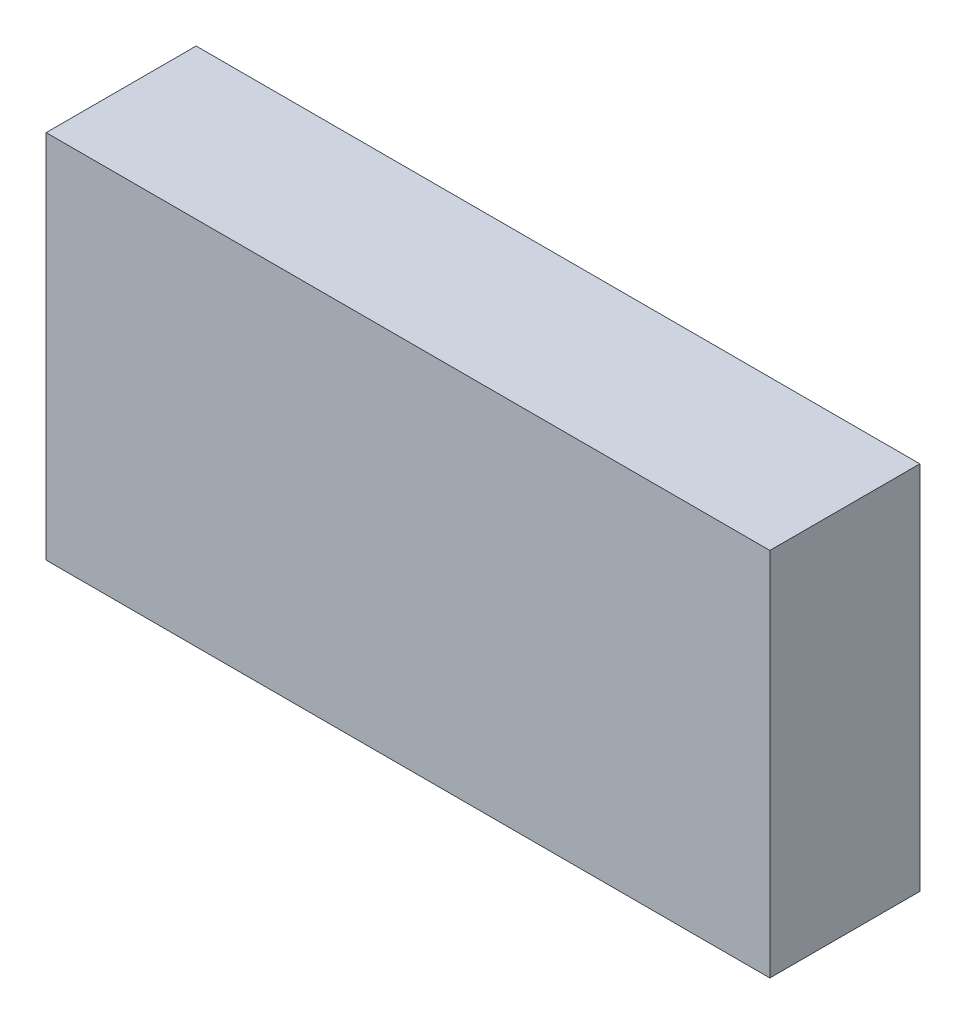
ISO-10303-21;
HEADER;
FILE_DESCRIPTION(('STEP AP214'),'2;1');
FILE_NAME('part.step','',(''),(''),'','','');
FILE_SCHEMA(('AUTOMOTIVE_DESIGN { 1 0 10303 214 1 1 1 1 }'));
ENDSEC;
DATA;
#1=APPLICATION_CONTEXT('core data for automotive mechanical design processes');
#2=APPLICATION_PROTOCOL_DEFINITION('international standard','automotive_design',2000,#1);
#3=PRODUCT_CONTEXT('',#1,'mechanical');
#4=PRODUCT('Part','Part','',(#3));
#5=PRODUCT_RELATED_PRODUCT_CATEGORY('part','',(#4));
#6=PRODUCT_DEFINITION_FORMATION('','',#4);
#7=PRODUCT_DEFINITION_CONTEXT('part definition',#1,'design');
#8=PRODUCT_DEFINITION('design','',#6,#7);
#9=PRODUCT_DEFINITION_SHAPE('','',#8);
#10=(LENGTH_UNIT() NAMED_UNIT(*) SI_UNIT(.MILLI.,.METRE.));
#11=(NAMED_UNIT(*) PLANE_ANGLE_UNIT() SI_UNIT($,.RADIAN.));
#12=(NAMED_UNIT(*) SI_UNIT($,.STERADIAN.) SOLID_ANGLE_UNIT());
#13=UNCERTAINTY_MEASURE_WITH_UNIT(LENGTH_MEASURE(1.E-05),#10,'distance_accuracy_value','');
#14=(GEOMETRIC_REPRESENTATION_CONTEXT(3) GLOBAL_UNCERTAINTY_ASSIGNED_CONTEXT((#13)) GLOBAL_UNIT_ASSIGNED_CONTEXT((#10,
#11,#12)) REPRESENTATION_CONTEXT('',''));
#15=CARTESIAN_POINT('',(0.,0.,0.));
#16=DIRECTION('',(0.,0.,1.));
#17=DIRECTION('',(1.,0.,0.));
#18=AXIS2_PLACEMENT_3D('',#15,#16,#17);
#19=CARTESIAN_POINT('',(35.22,18.02,14.6));
#20=DIRECTION('',(-1.,0.,0.));
#21=DIRECTION('',(0.,-1.,0.));
#22=AXIS2_PLACEMENT_3D('',#19,#20,#21);
#23=PLANE('',#22);
#24=DIRECTION('',(0.,1.,0.));
#25=VECTOR('',#24,1.);
#26=CARTESIAN_POINT('',(35.22,18.02,0.));
#27=LINE('',#26,#25);
#28=CARTESIAN_POINT('',(35.22,-18.02,0.));
#29=VERTEX_POINT('',#28);
#30=CARTESIAN_POINT('',(35.22,18.02,0.));
#31=VERTEX_POINT('',#30);
#32=EDGE_CURVE('E99',#29,#31,#27,.T.);
#33=ORIENTED_EDGE('',*,*,#32,.T.);
#34=DIRECTION('',(0.,0.,-1.));
#35=VECTOR('',#34,1.);
#36=CARTESIAN_POINT('',(35.22,18.02,14.6));
#37=LINE('',#36,#35);
#38=CARTESIAN_POINT('',(35.22,18.02,14.6));
#39=VERTEX_POINT('',#38);
#40=EDGE_CURVE('E11',#39,#31,#37,.T.);
#41=ORIENTED_EDGE('',*,*,#40,.F.);
#42=DIRECTION('',(0.,1.,0.));
#43=VECTOR('',#42,1.);
#44=CARTESIAN_POINT('',(35.22,18.02,14.6));
#45=LINE('',#44,#43);
#46=CARTESIAN_POINT('',(35.22,-18.02,14.6));
#47=VERTEX_POINT('',#46);
#48=EDGE_CURVE('E87',#47,#39,#45,.T.);
#49=ORIENTED_EDGE('',*,*,#48,.F.);
#50=DIRECTION('',(0.,0.,-1.));
#51=VECTOR('',#50,1.);
#52=CARTESIAN_POINT('',(35.22,-18.02,14.6));
#53=LINE('',#52,#51);
#54=EDGE_CURVE('E95',#47,#29,#53,.T.);
#55=ORIENTED_EDGE('',*,*,#54,.T.);
#56=EDGE_LOOP('',(#33,#41,#49,#55));
#57=FACE_BOUND('',#56,.T.);
#58=ADVANCED_FACE('F36',(#57),#23,.F.);
#59=CARTESIAN_POINT('',(-35.22,18.02,14.6));
#60=DIRECTION('',(0.,-1.,0.));
#61=DIRECTION('',(0.,0.,-1.));
#62=AXIS2_PLACEMENT_3D('',#59,#60,#61);
#63=PLANE('',#62);
#64=DIRECTION('',(-1.,0.,0.));
#65=VECTOR('',#64,1.);
#66=CARTESIAN_POINT('',(-35.22,18.02,0.));
#67=LINE('',#66,#65);
#68=CARTESIAN_POINT('',(-35.22,18.02,0.));
#69=VERTEX_POINT('',#68);
#70=EDGE_CURVE('E91',#31,#69,#67,.T.);
#71=ORIENTED_EDGE('',*,*,#70,.T.);
#72=DIRECTION('',(0.,0.,-1.));
#73=VECTOR('',#72,1.);
#74=CARTESIAN_POINT('',(-35.22,18.02,14.6));
#75=LINE('',#74,#73);
#76=CARTESIAN_POINT('',(-35.22,18.02,14.6));
#77=VERTEX_POINT('',#76);
#78=EDGE_CURVE('E44',#77,#69,#75,.T.);
#79=ORIENTED_EDGE('',*,*,#78,.F.);
#80=DIRECTION('',(-1.,0.,0.));
#81=VECTOR('',#80,1.);
#82=CARTESIAN_POINT('',(-35.22,18.02,14.6));
#83=LINE('',#82,#81);
#84=EDGE_CURVE('E82',#39,#77,#83,.T.);
#85=ORIENTED_EDGE('',*,*,#84,.F.);
#86=ORIENTED_EDGE('',*,*,#40,.T.);
#87=EDGE_LOOP('',(#71,#79,#85,#86));
#88=FACE_BOUND('',#87,.T.);
#89=ADVANCED_FACE('F90',(#88),#63,.F.);
#90=CARTESIAN_POINT('',(-35.22,18.02,14.6));
#91=DIRECTION('',(1.,0.,0.));
#92=DIRECTION('',(0.,1.,0.));
#93=AXIS2_PLACEMENT_3D('',#90,#91,#92);
#94=PLANE('',#93);
#95=DIRECTION('',(0.,-1.,0.));
#96=VECTOR('',#95,1.);
#97=CARTESIAN_POINT('',(-35.22,18.02,0.));
#98=LINE('',#97,#96);
#99=CARTESIAN_POINT('',(-35.22,-18.02,0.));
#100=VERTEX_POINT('',#99);
#101=EDGE_CURVE('E69',#69,#100,#98,.T.);
#102=ORIENTED_EDGE('',*,*,#101,.T.);
#103=DIRECTION('',(0.,0.,-1.));
#104=VECTOR('',#103,1.);
#105=CARTESIAN_POINT('',(-35.22,-18.02,14.6));
#106=LINE('',#105,#104);
#107=CARTESIAN_POINT('',(-35.22,-18.02,14.6));
#108=VERTEX_POINT('',#107);
#109=EDGE_CURVE('E92',#108,#100,#106,.T.);
#110=ORIENTED_EDGE('',*,*,#109,.F.);
#111=DIRECTION('',(0.,-1.,0.));
#112=VECTOR('',#111,1.);
#113=CARTESIAN_POINT('',(-35.22,18.02,14.6));
#114=LINE('',#113,#112);
#115=EDGE_CURVE('E85',#77,#108,#114,.T.);
#116=ORIENTED_EDGE('',*,*,#115,.F.);
#117=ORIENTED_EDGE('',*,*,#78,.T.);
#118=EDGE_LOOP('',(#102,#110,#116,#117));
#119=FACE_BOUND('',#118,.T.);
#120=ADVANCED_FACE('F93',(#119),#94,.F.);
#121=CARTESIAN_POINT('',(-35.22,-18.02,14.6));
#122=DIRECTION('',(0.,1.,0.));
#123=DIRECTION('',(0.,0.,1.));
#124=AXIS2_PLACEMENT_3D('',#121,#122,#123);
#125=PLANE('',#124);
#126=DIRECTION('',(1.,0.,0.));
#127=VECTOR('',#126,1.);
#128=CARTESIAN_POINT('',(-35.22,-18.02,0.));
#129=LINE('',#128,#127);
#130=EDGE_CURVE('E75',#100,#29,#129,.T.);
#131=ORIENTED_EDGE('',*,*,#130,.T.);
#132=ORIENTED_EDGE('',*,*,#54,.F.);
#133=DIRECTION('',(1.,0.,0.));
#134=VECTOR('',#133,1.);
#135=CARTESIAN_POINT('',(-35.22,-18.02,14.6));
#136=LINE('',#135,#134);
#137=EDGE_CURVE('E52',#108,#47,#136,.T.);
#138=ORIENTED_EDGE('',*,*,#137,.F.);
#139=ORIENTED_EDGE('',*,*,#109,.T.);
#140=EDGE_LOOP('',(#131,#132,#138,#139));
#141=FACE_BOUND('',#140,.T.);
#142=ADVANCED_FACE('F106',(#141),#125,.F.);
#143=CARTESIAN_POINT('',(0.,0.,14.6));
#144=DIRECTION('',(0.,0.,1.));
#145=DIRECTION('',(1.,0.,0.));
#146=AXIS2_PLACEMENT_3D('',#143,#144,#145);
#147=PLANE('',#146);
#148=ORIENTED_EDGE('',*,*,#48,.T.);
#149=ORIENTED_EDGE('',*,*,#84,.T.);
#150=ORIENTED_EDGE('',*,*,#115,.T.);
#151=ORIENTED_EDGE('',*,*,#137,.T.);
#152=EDGE_LOOP('',(#148,#149,#150,#151));
#153=FACE_BOUND('',#152,.T.);
#154=ADVANCED_FACE('F83',(#153),#147,.T.);
#155=CARTESIAN_POINT('',(0.,0.,0.));
#156=DIRECTION('',(0.,0.,1.));
#157=DIRECTION('',(1.,0.,0.));
#158=AXIS2_PLACEMENT_3D('',#155,#156,#157);
#159=PLANE('',#158);
#160=ORIENTED_EDGE('',*,*,#32,.F.);
#161=ORIENTED_EDGE('',*,*,#130,.F.);
#162=ORIENTED_EDGE('',*,*,#101,.F.);
#163=ORIENTED_EDGE('',*,*,#70,.F.);
#164=EDGE_LOOP('',(#160,#161,#162,#163));
#165=FACE_BOUND('',#164,.T.);
#166=ADVANCED_FACE('F109',(#165),#159,.F.);
#167=CLOSED_SHELL('',(#58,#89,#120,#142,#154,#166));
#168=MANIFOLD_SOLID_BREP('B2',#167);
#169=ADVANCED_BREP_SHAPE_REPRESENTATION('',(#18,#168),#14);
#170=SHAPE_DEFINITION_REPRESENTATION(#9,#169);
ENDSEC;
END-ISO-10303-21;
